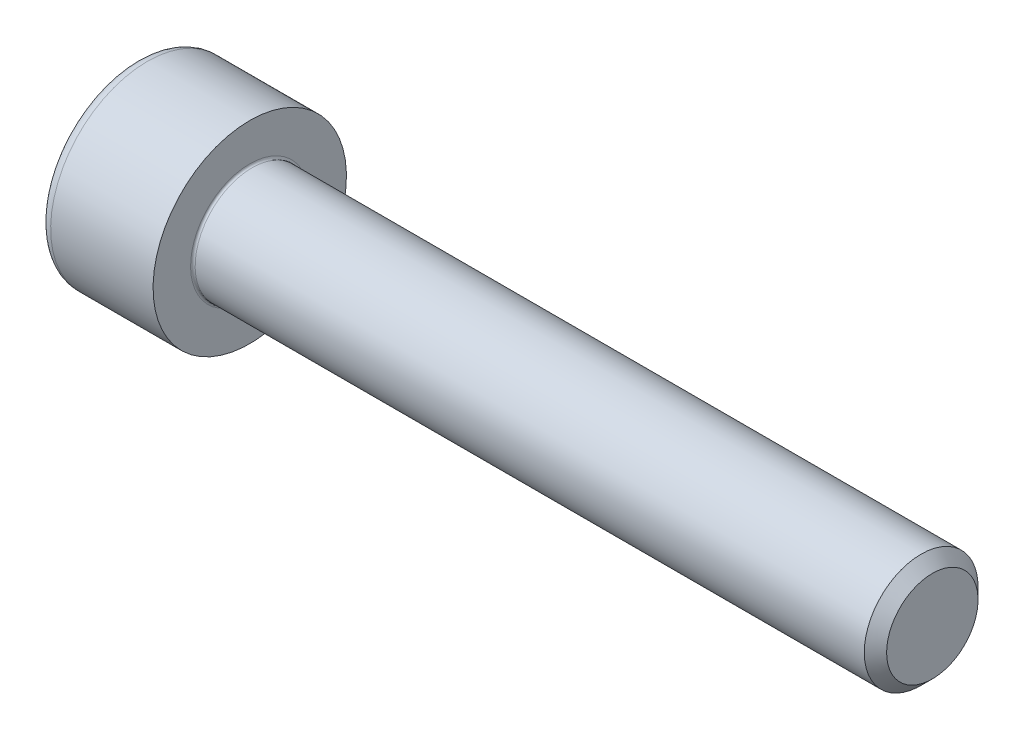
ISO-10303-21;
HEADER;
FILE_DESCRIPTION(('STEP AP214'),'2;1');
FILE_NAME('part.step','',(''),(''),'','','');
FILE_SCHEMA(('AUTOMOTIVE_DESIGN { 1 0 10303 214 1 1 1 1 }'));
ENDSEC;
DATA;
#1=APPLICATION_CONTEXT('core data for automotive mechanical design processes');
#2=APPLICATION_PROTOCOL_DEFINITION('international standard','automotive_design',2000,#1);
#3=PRODUCT_CONTEXT('',#1,'mechanical');
#4=PRODUCT('Part','Part','',(#3));
#5=PRODUCT_RELATED_PRODUCT_CATEGORY('part','',(#4));
#6=PRODUCT_DEFINITION_FORMATION('','',#4);
#7=PRODUCT_DEFINITION_CONTEXT('part definition',#1,'design');
#8=PRODUCT_DEFINITION('design','',#6,#7);
#9=PRODUCT_DEFINITION_SHAPE('','',#8);
#10=(LENGTH_UNIT() NAMED_UNIT(*) SI_UNIT(.MILLI.,.METRE.));
#11=(NAMED_UNIT(*) PLANE_ANGLE_UNIT() SI_UNIT($,.RADIAN.));
#12=(NAMED_UNIT(*) SI_UNIT($,.STERADIAN.) SOLID_ANGLE_UNIT());
#13=UNCERTAINTY_MEASURE_WITH_UNIT(LENGTH_MEASURE(1.E-05),#10,'distance_accuracy_value','');
#14=(GEOMETRIC_REPRESENTATION_CONTEXT(3) GLOBAL_UNCERTAINTY_ASSIGNED_CONTEXT((#13)) GLOBAL_UNIT_ASSIGNED_CONTEXT((#10,
#11,#12)) REPRESENTATION_CONTEXT('',''));
#15=CARTESIAN_POINT('',(0.,0.,0.));
#16=DIRECTION('',(0.,0.,1.));
#17=DIRECTION('',(1.,0.,0.));
#18=AXIS2_PLACEMENT_3D('',#15,#16,#17);
#19=CARTESIAN_POINT('',(-2.50800000128493,0.,0.));
#20=DIRECTION('',(-1.,0.,0.));
#21=DIRECTION('',(0.,0.,1.));
#22=AXIS2_PLACEMENT_3D('',#19,#20,#21);
#23=CONICAL_SURFACE('',#22,2.32325748231688,1.04719754991398);
#24=CARTESIAN_POINT('',(-1.16666666468745,-1.70530256582424E-10,0.));
#25=VERTEX_POINT('',#24);
#26=VERTEX_LOOP('',#25);
#27=FACE_BOUND('',#26,.T.);
#28=CARTESIAN_POINT('',(-2.50000000144598,2.00000000032935,1.15470053796183));
#29=CARTESIAN_POINT('',(-2.47069554662332,2.00000000011829,1.05321634684252));
#30=CARTESIAN_POINT('',(-2.44404467857914,2.00000000003171,0.950856145644057));
#31=CARTESIAN_POINT('',(-2.39752638879754,1.99999999996822,0.74436344483934));
#32=CARTESIAN_POINT('',(-2.37767542167161,1.99999999999159,0.640227277451711));
#33=CARTESIAN_POINT('',(-2.34677596020227,2.00000000000821,0.433245449996193));
#34=CARTESIAN_POINT('',(-2.33552178883748,2.00000000000219,0.330431627814834));
#35=CARTESIAN_POINT('',(-2.32208916936555,1.99999999999782,0.124320462843912));
#36=CARTESIAN_POINT('',(-2.31989959521926,1.99999999999945,0.0210238686983639));
#37=CARTESIAN_POINT('',(-2.32446629144478,2.00000000000048,-0.17197473597635));
#38=CARTESIAN_POINT('',(-2.33010128653034,2.00000000000013,-0.261705707519009));
#39=CARTESIAN_POINT('',(-2.34795730208613,1.99999999999987,-0.440583082591421));
#40=CARTESIAN_POINT('',(-2.36018441616651,1.99999999999996,-0.52972886789387));
#41=CARTESIAN_POINT('',(-2.39074983480228,2.00000000000004,-0.708974747227483));
#42=CARTESIAN_POINT('',(-2.40921764371906,2.00000000000002,-0.799052166717739));
#43=CARTESIAN_POINT('',(-2.45113176241741,1.99999999999998,-0.977863889553509));
#44=CARTESIAN_POINT('',(-2.47456823037067,1.99999999999996,-1.06660048191678));
#45=CARTESIAN_POINT('',(-2.50000000166014,2.,-1.15470053795676));
#46=B_SPLINE_CURVE_WITH_KNOTS('',3,(#28,#29,#30,#31,#32,#33,#34,#35,#36,#37,#38,#39,#40,#41,#42,
#43,#44,#45),.UNSPECIFIED.,.F.,.F.,(4,2,2,2,2,2,2,2,4),(0.,0.317016011622895,0.6347938171706,
0.944707606337703,1.25424088911858,1.52370778260774,1.79342419352783,2.06912162199575,
2.3442779727913),.UNSPECIFIED.);
#47=CARTESIAN_POINT('',(-2.50000000164502,1.99999999979437,1.15470053826053));
#48=VERTEX_POINT('',#47);
#49=CARTESIAN_POINT('',(-2.50000000171356,2.,-1.15470053814181));
#50=VERTEX_POINT('',#49);
#51=EDGE_CURVE('E21',#48,#50,#46,.T.);
#52=ORIENTED_EDGE('',*,*,#51,.T.);
#53=CARTESIAN_POINT('',(-2.50000000144598,1.99999999980318,-1.15470053887319));
#54=CARTESIAN_POINT('',(-2.47069554662332,1.91211211210581,-1.20544263425006));
#55=CARTESIAN_POINT('',(-2.44404467857914,1.82346557748816,-1.2566227347743));
#56=CARTESIAN_POINT('',(-2.39752638879754,1.64463765286348,-1.35986908512169));
#57=CARTESIAN_POINT('',(-2.37767542167161,1.55445308646473,-1.41193716883574));
#58=CARTESIAN_POINT('',(-2.34677596020227,1.37520156577483,-1.51542808257789));
#59=CARTESIAN_POINT('',(-2.33552178883748,1.28616218390259,-1.56683499366335));
#60=CARTESIAN_POINT('',(-2.32208916936555,1.10766467903198,-1.66989057614503));
#61=CARTESIAN_POINT('',(-2.31989959521926,1.01820720437834,-1.72153887321922));
#62=CARTESIAN_POINT('',(-2.32446629144478,0.851065509835601,-1.81803817555747));
#63=CARTESIAN_POINT('',(-2.33010128653034,0.773356208973225,-1.86290366132849));
#64=CARTESIAN_POINT('',(-2.34795730208613,0.61844385799811,-1.95234234886448));
#65=CARTESIAN_POINT('',(-2.36018441616651,0.541241343285922,-1.99691524151578));
#66=CARTESIAN_POINT('',(-2.39074983480228,0.38600985825937,-2.08653818118265));
#67=CARTESIAN_POINT('',(-2.40921764371906,0.30800052467345,-2.13157689092776));
#68=CARTESIAN_POINT('',(-2.45113176241741,0.153145030203193,-2.22098275234562));
#69=CARTESIAN_POINT('',(-2.47456823037067,0.0762968869713288,-2.26535104852723));
#70=CARTESIAN_POINT('',(-2.50000000166014,3.65892201025004E-10,-2.30940107654726));
#71=B_SPLINE_CURVE_WITH_KNOTS('',3,(#53,#54,#55,#56,#57,#58,#59,#60,#61,#62,#63,#64,#65,#66,#67,
#68,#69,#70),.UNSPECIFIED.,.F.,.F.,(4,2,2,2,2,2,2,2,4),(0.,0.317016011622895,0.634793817170599,
0.944707606337703,1.25424088911857,1.52370778260774,1.79342419352783,2.06912162199575,
2.3442779727913),.UNSPECIFIED.);
#72=CARTESIAN_POINT('',(-2.50000000164502,0.,-2.30940107652106));
#73=VERTEX_POINT('',#72);
#74=EDGE_CURVE('E81',#50,#73,#71,.T.);
#75=ORIENTED_EDGE('',*,*,#74,.T.);
#76=CARTESIAN_POINT('',(-2.50000000144598,-5.26170709131917E-10,-2.30940107683502));
#77=CARTESIAN_POINT('',(-2.47069554662332,-0.0878878880124767,-2.25865898109258));
#78=CARTESIAN_POINT('',(-2.44404467857914,-0.17653442254354,-2.20747888041836));
#79=CARTESIAN_POINT('',(-2.39752638879754,-0.355362347104743,-2.10423252996103));
#80=CARTESIAN_POINT('',(-2.37767542167161,-0.445546913526861,-2.05216444628745));
#81=CARTESIAN_POINT('',(-2.34677596020227,-0.624798434233376,-1.94867353257408));
#82=CARTESIAN_POINT('',(-2.33552178883748,-0.7138378160996,-1.89726662147819));
#83=CARTESIAN_POINT('',(-2.32208916936555,-0.892335320965837,-1.79421103898894));
#84=CARTESIAN_POINT('',(-2.31989959521926,-0.981792795621112,-1.74256274191759));
#85=CARTESIAN_POINT('',(-2.32446629144478,-1.14893449016488,-1.64606343958112));
#86=CARTESIAN_POINT('',(-2.33010128653034,-1.2266437910269,-1.60119795380949));
#87=CARTESIAN_POINT('',(-2.34795730208613,-1.38155614200176,-1.51175926627306));
#88=CARTESIAN_POINT('',(-2.36018441616651,-1.45875865671404,-1.46718637362191));
#89=CARTESIAN_POINT('',(-2.39074983480228,-1.61399014174067,-1.37756343395517));
#90=CARTESIAN_POINT('',(-2.40921764371906,-1.69199947532657,-1.33252472421003));
#91=CARTESIAN_POINT('',(-2.45113176241741,-1.84685496979679,-1.24311886279211));
#92=CARTESIAN_POINT('',(-2.47456823037067,-1.92370311302863,-1.19875056661046));
#93=CARTESIAN_POINT('',(-2.50000000166014,-1.99999999963411,-1.1547005385905));
#94=B_SPLINE_CURVE_WITH_KNOTS('',3,(#76,#77,#78,#79,#80,#81,#82,#83,#84,#85,#86,#87,#88,#89,#90,
#91,#92,#93),.UNSPECIFIED.,.F.,.F.,(4,2,2,2,2,2,2,2,4),(0.,0.317016011622895,0.634793817170599,
0.944707606337702,1.25424088911857,1.52370778260774,1.79342419352783,2.06912162199575,
2.3442779727913),.UNSPECIFIED.);
#95=CARTESIAN_POINT('',(-2.50000000164502,-1.99999999979437,-1.15470053826053));
#96=VERTEX_POINT('',#95);
#97=EDGE_CURVE('E106',#73,#96,#94,.T.);
#98=ORIENTED_EDGE('',*,*,#97,.T.);
#99=CARTESIAN_POINT('',(-2.50000000144598,-2.00000000032935,-1.15470053796183));
#100=CARTESIAN_POINT('',(-2.47069554662332,-2.00000000011829,-1.05321634684252));
#101=CARTESIAN_POINT('',(-2.44404467857914,-2.0000000000317,-0.95085614564406));
#102=CARTESIAN_POINT('',(-2.39752638879754,-1.99999999996822,-0.744363444839343));
#103=CARTESIAN_POINT('',(-2.37767542167161,-1.99999999999159,-0.640227277451715));
#104=CARTESIAN_POINT('',(-2.34677596020227,-2.00000000000821,-0.433245449996196));
#105=CARTESIAN_POINT('',(-2.33552178883748,-2.00000000000219,-0.330431627814838));
#106=CARTESIAN_POINT('',(-2.32208916936555,-1.99999999999782,-0.124320462843916));
#107=CARTESIAN_POINT('',(-2.31989959521926,-1.99999999999945,-0.0210238686983675));
#108=CARTESIAN_POINT('',(-2.32446629144478,-2.00000000000048,0.171974735976346));
#109=CARTESIAN_POINT('',(-2.33010128653034,-2.00000000000013,0.261705707519006));
#110=CARTESIAN_POINT('',(-2.34795730208613,-1.99999999999987,0.440583082591418));
#111=CARTESIAN_POINT('',(-2.36018441616651,-1.99999999999996,0.529728867893867));
#112=CARTESIAN_POINT('',(-2.39074983480228,-2.00000000000004,0.70897474722748));
#113=CARTESIAN_POINT('',(-2.40921764371906,-2.00000000000002,0.799052166717737));
#114=CARTESIAN_POINT('',(-2.45113176241741,-1.99999999999998,0.977863889553506));
#115=CARTESIAN_POINT('',(-2.47456823037067,-1.99999999999996,1.06660048191678));
#116=CARTESIAN_POINT('',(-2.50000000166014,-2.,1.15470053795676));
#117=B_SPLINE_CURVE_WITH_KNOTS('',3,(#99,#100,#101,#102,#103,#104,#105,#106,#107,#108,#109,#110,
#111,#112,#113,#114,#115,#116),.UNSPECIFIED.,.F.,.F.,(4,2,2,2,2,2,2,2,4),(0.,0.317016011622895,
0.634793817170599,0.944707606337703,1.25424088911857,1.52370778260774,1.79342419352783,
2.06912162199575,2.3442779727913),.UNSPECIFIED.);
#118=CARTESIAN_POINT('',(-2.50000000164502,-1.99999999979437,1.15470053826053));
#119=VERTEX_POINT('',#118);
#120=EDGE_CURVE('E130',#96,#119,#117,.T.);
#121=ORIENTED_EDGE('',*,*,#120,.T.);
#122=CARTESIAN_POINT('',(-2.50000000144598,-1.99999999980318,1.15470053887318));
#123=CARTESIAN_POINT('',(-2.47069554662332,-1.91211211210581,1.20544263425006));
#124=CARTESIAN_POINT('',(-2.44404467857914,-1.82346557748816,1.2566227347743));
#125=CARTESIAN_POINT('',(-2.39752638879754,-1.64463765286348,1.35986908512168));
#126=CARTESIAN_POINT('',(-2.37767542167161,-1.55445308646473,1.41193716883573));
#127=CARTESIAN_POINT('',(-2.34677596020227,-1.37520156577483,1.51542808257788));
#128=CARTESIAN_POINT('',(-2.33552178883748,-1.28616218390259,1.56683499366335));
#129=CARTESIAN_POINT('',(-2.32208916936555,-1.10766467903198,1.66989057614503));
#130=CARTESIAN_POINT('',(-2.31989959521926,-1.01820720437834,1.72153887321922));
#131=CARTESIAN_POINT('',(-2.32446629144478,-0.851065509835602,1.81803817555746));
#132=CARTESIAN_POINT('',(-2.33010128653034,-0.773356208973226,1.86290366132849));
#133=CARTESIAN_POINT('',(-2.34795730208613,-0.61844385799811,1.95234234886448));
#134=CARTESIAN_POINT('',(-2.36018441616651,-0.541241343285922,1.99691524151578));
#135=CARTESIAN_POINT('',(-2.39074983480228,-0.38600985825937,2.08653818118265));
#136=CARTESIAN_POINT('',(-2.40921764371906,-0.30800052467345,2.13157689092776));
#137=CARTESIAN_POINT('',(-2.45113176241741,-0.153145030203193,2.22098275234561));
#138=CARTESIAN_POINT('',(-2.47456823037067,-0.076296886971328,2.26535104852723));
#139=CARTESIAN_POINT('',(-2.50000000166014,-3.65891067023528E-10,2.30940107654726));
#140=B_SPLINE_CURVE_WITH_KNOTS('',3,(#122,#123,#124,#125,#126,#127,#128,#129,#130,#131,#132,
#133,#134,#135,#136,#137,#138,#139),.UNSPECIFIED.,.F.,.F.,(4,2,2,2,2,2,2,2,4),(0.,
0.317016011622895,0.634793817170599,0.944707606337703,1.25424088911857,1.52370778260774,
1.79342419352784,2.06912162199575,2.3442779727913),.UNSPECIFIED.);
#141=CARTESIAN_POINT('',(-2.50000000164502,0.,2.30940107652106));
#142=VERTEX_POINT('',#141);
#143=EDGE_CURVE('E138',#119,#142,#140,.T.);
#144=ORIENTED_EDGE('',*,*,#143,.T.);
#145=CARTESIAN_POINT('',(-2.50000000144598,5.26171169347496E-10,2.30940107683502));
#146=CARTESIAN_POINT('',(-2.47069554662332,0.087887888012477,2.25865898109258));
#147=CARTESIAN_POINT('',(-2.44404467857914,0.17653442254354,2.20747888041836));
#148=CARTESIAN_POINT('',(-2.39752638879754,0.355362347104743,2.10423252996103));
#149=CARTESIAN_POINT('',(-2.37767542167161,0.445546913526861,2.05216444628745));
#150=CARTESIAN_POINT('',(-2.34677596020227,0.624798434233376,1.94867353257408));
#151=CARTESIAN_POINT('',(-2.33552178883748,0.713837816099599,1.89726662147819));
#152=CARTESIAN_POINT('',(-2.32208916936555,0.892335320965837,1.79421103898894));
#153=CARTESIAN_POINT('',(-2.31989959521926,0.981792795621111,1.74256274191759));
#154=CARTESIAN_POINT('',(-2.32446629144478,1.14893449016488,1.64606343958112));
#155=CARTESIAN_POINT('',(-2.33010128653034,1.2266437910269,1.60119795380948));
#156=CARTESIAN_POINT('',(-2.34795730208613,1.38155614200176,1.51175926627305));
#157=CARTESIAN_POINT('',(-2.3601844161665,1.45875865671404,1.46718637362191));
#158=CARTESIAN_POINT('',(-2.39074983480228,1.61399014174067,1.37756343395517));
#159=CARTESIAN_POINT('',(-2.40921764371906,1.69199947532657,1.33252472421002));
#160=CARTESIAN_POINT('',(-2.45113176241741,1.84685496979679,1.2431188627921));
#161=CARTESIAN_POINT('',(-2.47456823037067,1.92370311302863,1.19875056661045));
#162=CARTESIAN_POINT('',(-2.50000000166014,1.99999999963411,1.1547005385905));
#163=B_SPLINE_CURVE_WITH_KNOTS('',3,(#145,#146,#147,#148,#149,#150,#151,#152,#153,#154,#155,
#156,#157,#158,#159,#160,#161,#162),.UNSPECIFIED.,.F.,.F.,(4,2,2,2,2,2,2,2,4),(0.,
0.317016011622895,0.634793817170599,0.944707606337702,1.25424088911857,1.52370778260774,
1.79342419352783,2.06912162199575,2.3442779727913),.UNSPECIFIED.);
#164=EDGE_CURVE('E83',#142,#48,#163,.T.);
#165=ORIENTED_EDGE('',*,*,#164,.T.);
#166=EDGE_LOOP('',(#52,#75,#98,#121,#144,#165));
#167=FACE_BOUND('',#166,.T.);
#168=ADVANCED_FACE('F17',(#27,#167),#23,.F.);
#169=CARTESIAN_POINT('',(-5.,2.,1.15470053837925));
#170=DIRECTION('',(0.,1.,0.));
#171=DIRECTION('',(0.,0.,1.));
#172=AXIS2_PLACEMENT_3D('',#169,#170,#171);
#173=PLANE('',#172);
#174=DIRECTION('',(1.,0.,0.));
#175=VECTOR('',#174,1.);
#176=CARTESIAN_POINT('',(-5.,2.,1.15470053837925));
#177=LINE('',#176,#175);
#178=CARTESIAN_POINT('',(-5.,2.,1.15470053837925));
#179=VERTEX_POINT('',#178);
#180=EDGE_CURVE('E85',#48,#179,#177,.F.);
#181=ORIENTED_EDGE('',*,*,#180,.T.);
#182=DIRECTION('',(0.,0.,1.));
#183=VECTOR('',#182,1.);
#184=CARTESIAN_POINT('',(-5.,2.,0.));
#185=LINE('',#184,#183);
#186=CARTESIAN_POINT('',(-5.,2.,-1.15470053837925));
#187=VERTEX_POINT('',#186);
#188=EDGE_CURVE('E90',#187,#179,#185,.T.);
#189=ORIENTED_EDGE('',*,*,#188,.F.);
#190=DIRECTION('',(1.,0.,0.));
#191=VECTOR('',#190,1.);
#192=CARTESIAN_POINT('',(-5.,2.,-1.15470053837925));
#193=LINE('',#192,#191);
#194=EDGE_CURVE('E88',#187,#50,#193,.T.);
#195=ORIENTED_EDGE('',*,*,#194,.T.);
#196=ORIENTED_EDGE('',*,*,#51,.F.);
#197=EDGE_LOOP('',(#181,#189,#195,#196));
#198=FACE_BOUND('',#197,.T.);
#199=ADVANCED_FACE('F77',(#198),#173,.F.);
#200=CARTESIAN_POINT('',(-5.,0.,2.3094010767585));
#201=DIRECTION('',(0.,0.500000000000001,0.866025403784438));
#202=DIRECTION('',(0.,-0.866025403784438,0.500000000000001));
#203=AXIS2_PLACEMENT_3D('',#200,#201,#202);
#204=PLANE('',#203);
#205=DIRECTION('',(1.,0.,0.));
#206=VECTOR('',#205,1.);
#207=CARTESIAN_POINT('',(-5.,0.,2.3094010767585));
#208=LINE('',#207,#206);
#209=CARTESIAN_POINT('',(-5.,0.,2.3094010767585));
#210=VERTEX_POINT('',#209);
#211=EDGE_CURVE('E142',#142,#210,#208,.F.);
#212=ORIENTED_EDGE('',*,*,#211,.T.);
#213=DIRECTION('',(0.,-0.866025403784438,0.5));
#214=VECTOR('',#213,1.);
#215=CARTESIAN_POINT('',(-5.,2.,1.15470053837925));
#216=LINE('',#215,#214);
#217=EDGE_CURVE('E96',#179,#210,#216,.T.);
#218=ORIENTED_EDGE('',*,*,#217,.F.);
#219=ORIENTED_EDGE('',*,*,#180,.F.);
#220=ORIENTED_EDGE('',*,*,#164,.F.);
#221=EDGE_LOOP('',(#212,#218,#219,#220));
#222=FACE_BOUND('',#221,.T.);
#223=ADVANCED_FACE('F146',(#222),#204,.F.);
#224=CARTESIAN_POINT('',(-5.,-2.,1.15470053837925));
#225=DIRECTION('',(0.,-0.5,0.866025403784439));
#226=DIRECTION('',(0.,-0.866025403784439,-0.5));
#227=AXIS2_PLACEMENT_3D('',#224,#225,#226);
#228=PLANE('',#227);
#229=DIRECTION('',(1.,0.,0.));
#230=VECTOR('',#229,1.);
#231=CARTESIAN_POINT('',(-5.,-2.,1.15470053837925));
#232=LINE('',#231,#230);
#233=CARTESIAN_POINT('',(-5.,-2.,1.15470053837925));
#234=VERTEX_POINT('',#233);
#235=EDGE_CURVE('E137',#119,#234,#232,.F.);
#236=ORIENTED_EDGE('',*,*,#235,.T.);
#237=DIRECTION('',(0.,-0.866025403784439,-0.5));
#238=VECTOR('',#237,1.);
#239=CARTESIAN_POINT('',(-5.,0.,2.3094010767585));
#240=LINE('',#239,#238);
#241=EDGE_CURVE('E265',#210,#234,#240,.T.);
#242=ORIENTED_EDGE('',*,*,#241,.F.);
#243=ORIENTED_EDGE('',*,*,#211,.F.);
#244=ORIENTED_EDGE('',*,*,#143,.F.);
#245=EDGE_LOOP('',(#236,#242,#243,#244));
#246=FACE_BOUND('',#245,.T.);
#247=ADVANCED_FACE('F126',(#246),#228,.F.);
#248=CARTESIAN_POINT('',(-5.,-2.,-1.15470053837925));
#249=DIRECTION('',(0.,-1.,0.));
#250=DIRECTION('',(0.,0.,-1.));
#251=AXIS2_PLACEMENT_3D('',#248,#249,#250);
#252=PLANE('',#251);
#253=DIRECTION('',(1.,0.,0.));
#254=VECTOR('',#253,1.);
#255=CARTESIAN_POINT('',(-5.,-2.,-1.15470053837925));
#256=LINE('',#255,#254);
#257=CARTESIAN_POINT('',(-5.,-2.,-1.15470053837925));
#258=VERTEX_POINT('',#257);
#259=EDGE_CURVE('E136',#96,#258,#256,.F.);
#260=ORIENTED_EDGE('',*,*,#259,.T.);
#261=DIRECTION('',(0.,0.,1.));
#262=VECTOR('',#261,1.);
#263=CARTESIAN_POINT('',(-5.,-2.,0.));
#264=LINE('',#263,#262);
#265=EDGE_CURVE('E260',#234,#258,#264,.F.);
#266=ORIENTED_EDGE('',*,*,#265,.F.);
#267=ORIENTED_EDGE('',*,*,#235,.F.);
#268=ORIENTED_EDGE('',*,*,#120,.F.);
#269=EDGE_LOOP('',(#260,#266,#267,#268));
#270=FACE_BOUND('',#269,.T.);
#271=ADVANCED_FACE('F122',(#270),#252,.F.);
#272=CARTESIAN_POINT('',(-5.,0.,-2.3094010767585));
#273=DIRECTION('',(0.,-0.5,-0.866025403784439));
#274=DIRECTION('',(0.,0.866025403784439,-0.5));
#275=AXIS2_PLACEMENT_3D('',#272,#273,#274);
#276=PLANE('',#275);
#277=DIRECTION('',(1.,0.,0.));
#278=VECTOR('',#277,1.);
#279=CARTESIAN_POINT('',(-5.,0.,-2.3094010767585));
#280=LINE('',#279,#278);
#281=CARTESIAN_POINT('',(-5.,0.,-2.3094010767585));
#282=VERTEX_POINT('',#281);
#283=EDGE_CURVE('E39',#73,#282,#280,.F.);
#284=ORIENTED_EDGE('',*,*,#283,.T.);
#285=DIRECTION('',(0.,0.866025403784439,-0.5));
#286=VECTOR('',#285,1.);
#287=CARTESIAN_POINT('',(-5.,-2.,-1.15470053837925));
#288=LINE('',#287,#286);
#289=EDGE_CURVE('E255',#258,#282,#288,.T.);
#290=ORIENTED_EDGE('',*,*,#289,.F.);
#291=ORIENTED_EDGE('',*,*,#259,.F.);
#292=ORIENTED_EDGE('',*,*,#97,.F.);
#293=EDGE_LOOP('',(#284,#290,#291,#292));
#294=FACE_BOUND('',#293,.T.);
#295=ADVANCED_FACE('F116',(#294),#276,.F.);
#296=CARTESIAN_POINT('',(-5.,2.,-1.15470053837925));
#297=DIRECTION('',(0.,0.5,-0.866025403784439));
#298=DIRECTION('',(0.,0.866025403784439,0.5));
#299=AXIS2_PLACEMENT_3D('',#296,#297,#298);
#300=PLANE('',#299);
#301=ORIENTED_EDGE('',*,*,#194,.F.);
#302=DIRECTION('',(0.,0.866025403784439,0.499999999999999));
#303=VECTOR('',#302,1.);
#304=CARTESIAN_POINT('',(-5.,0.,-2.3094010767585));
#305=LINE('',#304,#303);
#306=EDGE_CURVE('E253',#282,#187,#305,.T.);
#307=ORIENTED_EDGE('',*,*,#306,.F.);
#308=ORIENTED_EDGE('',*,*,#283,.F.);
#309=ORIENTED_EDGE('',*,*,#74,.F.);
#310=EDGE_LOOP('',(#301,#307,#308,#309));
#311=FACE_BOUND('',#310,.T.);
#312=ADVANCED_FACE('F94',(#311),#300,.F.);
#313=CARTESIAN_POINT('',(-5.,3.27970053837925,0.));
#314=DIRECTION('',(-1.,0.,0.));
#315=DIRECTION('',(0.,0.,1.));
#316=AXIS2_PLACEMENT_3D('',#313,#314,#315);
#317=PLANE('',#316);
#318=ORIENTED_EDGE('',*,*,#289,.T.);
#319=ORIENTED_EDGE('',*,*,#306,.T.);
#320=ORIENTED_EDGE('',*,*,#188,.T.);
#321=ORIENTED_EDGE('',*,*,#217,.T.);
#322=ORIENTED_EDGE('',*,*,#241,.T.);
#323=ORIENTED_EDGE('',*,*,#265,.T.);
#324=EDGE_LOOP('',(#318,#319,#320,#321,#322,#323));
#325=FACE_BOUND('',#324,.T.);
#326=CARTESIAN_POINT('',(-5.,0.,0.));
#327=DIRECTION('',(1.,0.,0.));
#328=DIRECTION('',(0.,1.,0.));
#329=AXIS2_PLACEMENT_3D('',#326,#327,#328);
#330=CIRCLE('',#329,3.75);
#331=CARTESIAN_POINT('',(-5.,3.75,0.));
#332=VERTEX_POINT('',#331);
#333=EDGE_CURVE('E216',#332,#332,#330,.T.);
#334=ORIENTED_EDGE('',*,*,#333,.F.);
#335=EDGE_LOOP('',(#334));
#336=FACE_BOUND('',#335,.T.);
#337=ADVANCED_FACE('F115',(#325,#336),#317,.T.);
#338=CARTESIAN_POINT('',(-4.5,0.,0.));
#339=DIRECTION('',(1.,0.,0.));
#340=DIRECTION('',(0.,0.,-1.));
#341=AXIS2_PLACEMENT_3D('',#338,#339,#340);
#342=TOROIDAL_SURFACE('',#341,3.75,0.5);
#343=CARTESIAN_POINT('',(-4.5,0.,0.));
#344=DIRECTION('',(1.,0.,0.));
#345=DIRECTION('',(0.,1.,0.));
#346=AXIS2_PLACEMENT_3D('',#343,#344,#345);
#347=CIRCLE('',#346,4.25);
#348=CARTESIAN_POINT('',(-4.5,4.25,0.));
#349=VERTEX_POINT('',#348);
#350=EDGE_CURVE('E280',#349,#349,#347,.T.);
#351=ORIENTED_EDGE('',*,*,#350,.F.);
#352=EDGE_LOOP('',(#351));
#353=FACE_BOUND('',#352,.T.);
#354=ORIENTED_EDGE('',*,*,#333,.T.);
#355=EDGE_LOOP('',(#354));
#356=FACE_BOUND('',#355,.T.);
#357=ADVANCED_FACE('F200',(#353,#356),#342,.T.);
#358=CARTESIAN_POINT('',(-2.5,0.,0.));
#359=DIRECTION('',(1.,0.,0.));
#360=DIRECTION('',(0.,1.,0.));
#361=AXIS2_PLACEMENT_3D('',#358,#359,#360);
#362=CYLINDRICAL_SURFACE('',#361,4.25);
#363=ORIENTED_EDGE('',*,*,#350,.T.);
#364=EDGE_LOOP('',(#363));
#365=FACE_BOUND('',#364,.T.);
#366=CARTESIAN_POINT('',(0.,0.,0.));
#367=DIRECTION('',(1.,0.,0.));
#368=DIRECTION('',(0.,1.,0.));
#369=AXIS2_PLACEMENT_3D('',#366,#367,#368);
#370=CIRCLE('',#369,4.25);
#371=CARTESIAN_POINT('',(0.,4.25,0.));
#372=VERTEX_POINT('',#371);
#373=EDGE_CURVE('E104',#372,#372,#370,.T.);
#374=ORIENTED_EDGE('',*,*,#373,.F.);
#375=EDGE_LOOP('',(#374));
#376=FACE_BOUND('',#375,.T.);
#377=ADVANCED_FACE('F197',(#365,#376),#362,.T.);
#378=CARTESIAN_POINT('',(30.,1.25,0.));
#379=DIRECTION('',(1.,0.,0.));
#380=DIRECTION('',(0.,0.,-1.));
#381=AXIS2_PLACEMENT_3D('',#378,#379,#380);
#382=PLANE('',#381);
#383=CARTESIAN_POINT('',(30.0000000002569,0.,0.));
#384=DIRECTION('',(-1.,0.,0.));
#385=DIRECTION('',(0.,0.,1.));
#386=AXIS2_PLACEMENT_3D('',#383,#384,#385);
#387=CIRCLE('',#386,2.00924000017721);
#388=CARTESIAN_POINT('',(30.0000000002569,0.,2.00924000017721));
#389=VERTEX_POINT('',#388);
#390=EDGE_CURVE('E275',#389,#389,#387,.T.);
#391=ORIENTED_EDGE('',*,*,#390,.F.);
#392=EDGE_LOOP('',(#391));
#393=FACE_BOUND('',#392,.T.);
#394=ADVANCED_FACE('F194',(#393),#382,.T.);
#395=CARTESIAN_POINT('',(0.,3.375,0.));
#396=DIRECTION('',(1.,0.,0.));
#397=DIRECTION('',(0.,0.,-1.));
#398=AXIS2_PLACEMENT_3D('',#395,#396,#397);
#399=PLANE('',#398);
#400=CARTESIAN_POINT('',(0.,0.,0.));
#401=DIRECTION('',(1.,0.,0.));
#402=DIRECTION('',(0.,1.,0.));
#403=AXIS2_PLACEMENT_3D('',#400,#401,#402);
#404=CIRCLE('',#403,2.6);
#405=CARTESIAN_POINT('',(0.,2.6,0.));
#406=VERTEX_POINT('',#405);
#407=EDGE_CURVE('E181',#406,#406,#404,.F.);
#408=ORIENTED_EDGE('',*,*,#407,.T.);
#409=EDGE_LOOP('',(#408));
#410=FACE_BOUND('',#409,.T.);
#411=ORIENTED_EDGE('',*,*,#373,.T.);
#412=EDGE_LOOP('',(#411));
#413=FACE_BOUND('',#412,.T.);
#414=ADVANCED_FACE('F185',(#410,#413),#399,.T.);
#415=CARTESIAN_POINT('',(29.5092399998111,0.,0.));
#416=DIRECTION('',(-1.,0.,0.));
#417=DIRECTION('',(0.,0.,1.));
#418=AXIS2_PLACEMENT_3D('',#415,#416,#417);
#419=CONICAL_SURFACE('',#418,2.49999999971351,0.78539816247083);
#420=ORIENTED_EDGE('',*,*,#390,.T.);
#421=EDGE_LOOP('',(#420));
#422=FACE_BOUND('',#421,.T.);
#423=CARTESIAN_POINT('',(29.50924,0.,0.));
#424=DIRECTION('',(1.,0.,0.));
#425=DIRECTION('',(0.,1.,0.));
#426=AXIS2_PLACEMENT_3D('',#423,#424,#425);
#427=CIRCLE('',#426,2.5);
#428=CARTESIAN_POINT('',(29.50924,2.5,0.));
#429=VERTEX_POINT('',#428);
#430=EDGE_CURVE('E30',#429,#429,#427,.F.);
#431=ORIENTED_EDGE('',*,*,#430,.F.);
#432=EDGE_LOOP('',(#431));
#433=FACE_BOUND('',#432,.T.);
#434=ADVANCED_FACE('F163',(#422,#433),#419,.T.);
#435=CARTESIAN_POINT('',(0.100000000000002,0.,0.));
#436=DIRECTION('',(1.,0.,0.));
#437=DIRECTION('',(0.,0.,-1.));
#438=AXIS2_PLACEMENT_3D('',#435,#436,#437);
#439=TOROIDAL_SURFACE('',#438,2.6,0.1);
#440=CARTESIAN_POINT('',(0.100000000000003,0.,0.));
#441=DIRECTION('',(1.,0.,0.));
#442=DIRECTION('',(0.,1.,0.));
#443=AXIS2_PLACEMENT_3D('',#440,#441,#442);
#444=CIRCLE('',#443,2.5);
#445=CARTESIAN_POINT('',(0.100000000000003,2.5,0.));
#446=VERTEX_POINT('',#445);
#447=EDGE_CURVE('E11',#446,#446,#444,.T.);
#448=ORIENTED_EDGE('',*,*,#447,.F.);
#449=EDGE_LOOP('',(#448));
#450=FACE_BOUND('',#449,.T.);
#451=ORIENTED_EDGE('',*,*,#407,.F.);
#452=EDGE_LOOP('',(#451));
#453=FACE_BOUND('',#452,.T.);
#454=ADVANCED_FACE('F157',(#450,#453),#439,.F.);
#455=CARTESIAN_POINT('',(19.,0.,0.));
#456=DIRECTION('',(1.,0.,0.));
#457=DIRECTION('',(0.,1.,0.));
#458=AXIS2_PLACEMENT_3D('',#455,#456,#457);
#459=CYLINDRICAL_SURFACE('',#458,2.5);
#460=ORIENTED_EDGE('',*,*,#447,.T.);
#461=EDGE_LOOP('',(#460));
#462=FACE_BOUND('',#461,.T.);
#463=ORIENTED_EDGE('',*,*,#430,.T.);
#464=EDGE_LOOP('',(#463));
#465=FACE_BOUND('',#464,.T.);
#466=ADVANCED_FACE('F155',(#462,#465),#459,.T.);
#467=CLOSED_SHELL('',(#168,#199,#223,#247,#271,#295,#312,#337,#357,#377,#394,#414,#434,#454,#466));
#468=MANIFOLD_SOLID_BREP('B1',#467);
#469=ADVANCED_BREP_SHAPE_REPRESENTATION('',(#18,#468),#14);
#470=SHAPE_DEFINITION_REPRESENTATION(#9,#469);
ENDSEC;
END-ISO-10303-21;
